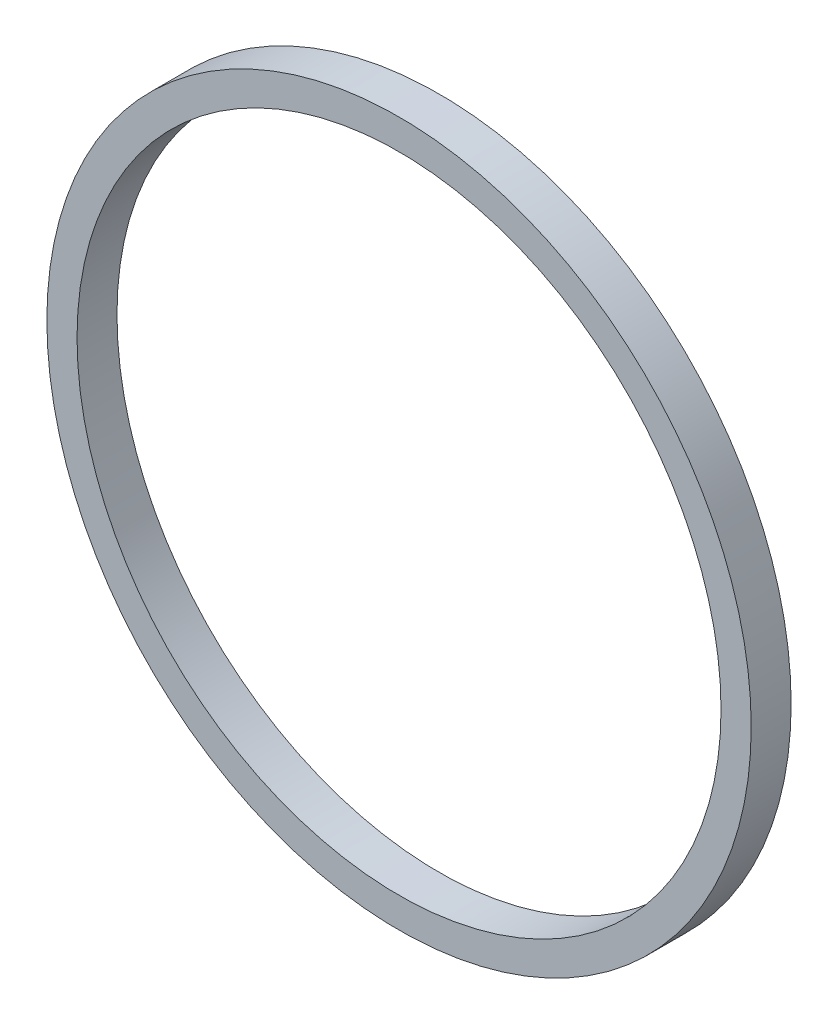
ISO-10303-21;
HEADER;
FILE_DESCRIPTION(('STEP AP214'),'2;1');
FILE_NAME('part.step','',(''),(''),'','','');
FILE_SCHEMA(('AUTOMOTIVE_DESIGN { 1 0 10303 214 1 1 1 1 }'));
ENDSEC;
DATA;
#1=APPLICATION_CONTEXT('core data for automotive mechanical design processes');
#2=APPLICATION_PROTOCOL_DEFINITION('international standard','automotive_design',2000,#1);
#3=PRODUCT_CONTEXT('',#1,'mechanical');
#4=PRODUCT('Part','Part','',(#3));
#5=PRODUCT_RELATED_PRODUCT_CATEGORY('part','',(#4));
#6=PRODUCT_DEFINITION_FORMATION('','',#4);
#7=PRODUCT_DEFINITION_CONTEXT('part definition',#1,'design');
#8=PRODUCT_DEFINITION('design','',#6,#7);
#9=PRODUCT_DEFINITION_SHAPE('','',#8);
#10=(LENGTH_UNIT() NAMED_UNIT(*) SI_UNIT(.MILLI.,.METRE.));
#11=(NAMED_UNIT(*) PLANE_ANGLE_UNIT() SI_UNIT($,.RADIAN.));
#12=(NAMED_UNIT(*) SI_UNIT($,.STERADIAN.) SOLID_ANGLE_UNIT());
#13=UNCERTAINTY_MEASURE_WITH_UNIT(LENGTH_MEASURE(1.E-05),#10,'distance_accuracy_value','');
#14=(GEOMETRIC_REPRESENTATION_CONTEXT(3) GLOBAL_UNCERTAINTY_ASSIGNED_CONTEXT((#13)) GLOBAL_UNIT_ASSIGNED_CONTEXT((#10,
#11,#12)) REPRESENTATION_CONTEXT('',''));
#15=CARTESIAN_POINT('',(0.,0.,0.));
#16=DIRECTION('',(0.,0.,1.));
#17=DIRECTION('',(1.,0.,0.));
#18=AXIS2_PLACEMENT_3D('',#15,#16,#17);
#19=CARTESIAN_POINT('',(0.,0.,1.984375));
#20=DIRECTION('',(0.,0.,1.));
#21=DIRECTION('',(1.,0.,0.));
#22=AXIS2_PLACEMENT_3D('',#19,#20,#21);
#23=PLANE('',#22);
#24=CARTESIAN_POINT('',(0.,0.,1.984375));
#25=DIRECTION('',(0.,0.,1.));
#26=DIRECTION('',(1.,0.,0.));
#27=AXIS2_PLACEMENT_3D('',#24,#25,#26);
#28=CIRCLE('',#27,17.5);
#29=CARTESIAN_POINT('',(17.5,0.,1.984375));
#30=VERTEX_POINT('',#29);
#31=EDGE_CURVE('E10',#30,#30,#28,.T.);
#32=ORIENTED_EDGE('',*,*,#31,.T.);
#33=EDGE_LOOP('',(#32));
#34=FACE_BOUND('',#33,.T.);
#35=CARTESIAN_POINT('',(0.,0.,1.984375));
#36=DIRECTION('',(0.,0.,1.));
#37=DIRECTION('',(1.,0.,0.));
#38=AXIS2_PLACEMENT_3D('',#35,#36,#37);
#39=CIRCLE('',#38,16.);
#40=CARTESIAN_POINT('',(16.,0.,1.984375));
#41=VERTEX_POINT('',#40);
#42=EDGE_CURVE('E40',#41,#41,#39,.T.);
#43=ORIENTED_EDGE('',*,*,#42,.F.);
#44=EDGE_LOOP('',(#43));
#45=FACE_BOUND('',#44,.T.);
#46=ADVANCED_FACE('F29',(#34,#45),#23,.T.);
#47=CARTESIAN_POINT('',(0.,0.,0.));
#48=DIRECTION('',(0.,0.,1.));
#49=DIRECTION('',(1.,0.,0.));
#50=AXIS2_PLACEMENT_3D('',#47,#48,#49);
#51=PLANE('',#50);
#52=CARTESIAN_POINT('',(0.,0.,0.));
#53=DIRECTION('',(0.,0.,1.));
#54=DIRECTION('',(1.,0.,0.));
#55=AXIS2_PLACEMENT_3D('',#52,#53,#54);
#56=CIRCLE('',#55,17.5);
#57=CARTESIAN_POINT('',(17.5,0.,0.));
#58=VERTEX_POINT('',#57);
#59=EDGE_CURVE('E33',#58,#58,#56,.T.);
#60=ORIENTED_EDGE('',*,*,#59,.F.);
#61=EDGE_LOOP('',(#60));
#62=FACE_BOUND('',#61,.T.);
#63=CARTESIAN_POINT('',(0.,0.,0.));
#64=DIRECTION('',(0.,0.,1.));
#65=DIRECTION('',(1.,0.,0.));
#66=AXIS2_PLACEMENT_3D('',#63,#64,#65);
#67=CIRCLE('',#66,16.);
#68=CARTESIAN_POINT('',(16.,0.,0.));
#69=VERTEX_POINT('',#68);
#70=EDGE_CURVE('E42',#69,#69,#67,.T.);
#71=ORIENTED_EDGE('',*,*,#70,.T.);
#72=EDGE_LOOP('',(#71));
#73=FACE_BOUND('',#72,.T.);
#74=ADVANCED_FACE('F52',(#62,#73),#51,.F.);
#75=CARTESIAN_POINT('',(0.,0.,1.984375));
#76=DIRECTION('',(0.,0.,-1.));
#77=DIRECTION('',(-1.,0.,0.));
#78=AXIS2_PLACEMENT_3D('',#75,#76,#77);
#79=CYLINDRICAL_SURFACE('',#78,17.5);
#80=ORIENTED_EDGE('',*,*,#31,.F.);
#81=EDGE_LOOP('',(#80));
#82=FACE_BOUND('',#81,.T.);
#83=ORIENTED_EDGE('',*,*,#59,.T.);
#84=EDGE_LOOP('',(#83));
#85=FACE_BOUND('',#84,.T.);
#86=ADVANCED_FACE('F31',(#82,#85),#79,.T.);
#87=CARTESIAN_POINT('',(0.,0.,1.984375));
#88=DIRECTION('',(0.,0.,-1.));
#89=DIRECTION('',(-1.,0.,0.));
#90=AXIS2_PLACEMENT_3D('',#87,#88,#89);
#91=CYLINDRICAL_SURFACE('',#90,16.);
#92=ORIENTED_EDGE('',*,*,#42,.T.);
#93=EDGE_LOOP('',(#92));
#94=FACE_BOUND('',#93,.T.);
#95=ORIENTED_EDGE('',*,*,#70,.F.);
#96=EDGE_LOOP('',(#95));
#97=FACE_BOUND('',#96,.T.);
#98=ADVANCED_FACE('F48',(#94,#97),#91,.F.);
#99=CLOSED_SHELL('',(#46,#74,#86,#98));
#100=MANIFOLD_SOLID_BREP('B2',#99);
#101=ADVANCED_BREP_SHAPE_REPRESENTATION('',(#18,#100),#14);
#102=SHAPE_DEFINITION_REPRESENTATION(#9,#101);
ENDSEC;
END-ISO-10303-21;
